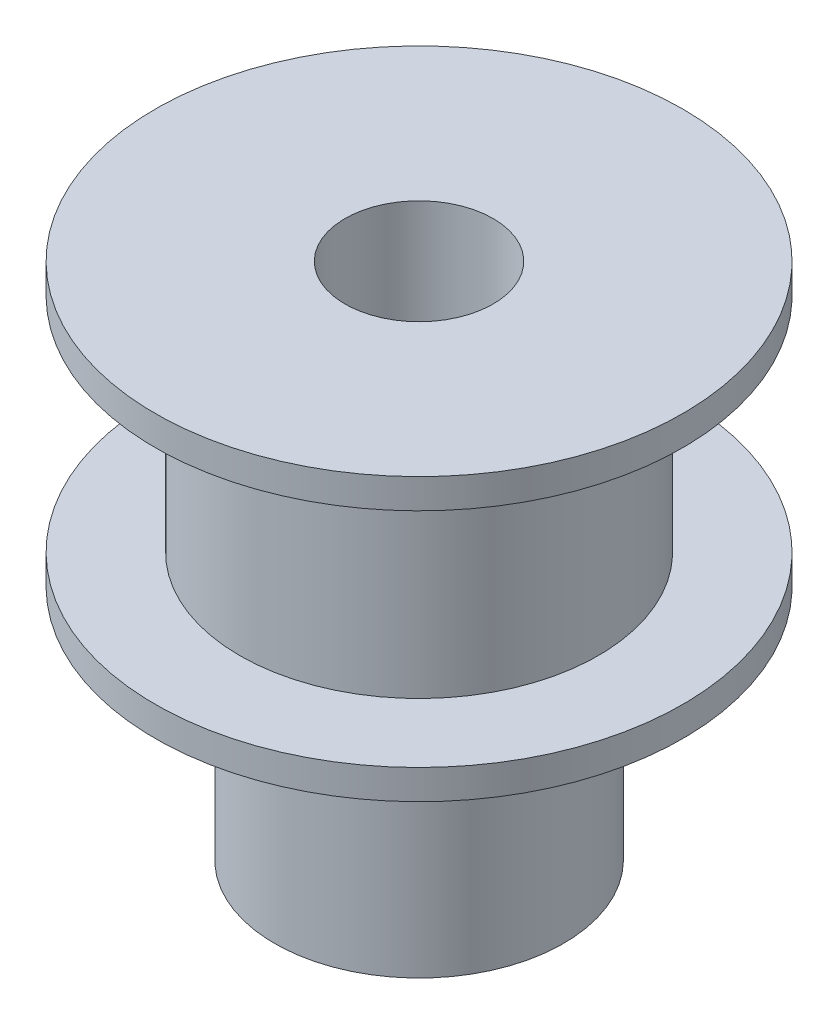
ISO-10303-21;
HEADER;
FILE_DESCRIPTION(('STEP AP214'),'2;1');
FILE_NAME('part.step','',(''),(''),'','','');
FILE_SCHEMA(('AUTOMOTIVE_DESIGN { 1 0 10303 214 1 1 1 1 }'));
ENDSEC;
DATA;
#1=APPLICATION_CONTEXT('core data for automotive mechanical design processes');
#2=APPLICATION_PROTOCOL_DEFINITION('international standard','automotive_design',2000,#1);
#3=PRODUCT_CONTEXT('',#1,'mechanical');
#4=PRODUCT('Part','Part','',(#3));
#5=PRODUCT_RELATED_PRODUCT_CATEGORY('part','',(#4));
#6=PRODUCT_DEFINITION_FORMATION('','',#4);
#7=PRODUCT_DEFINITION_CONTEXT('part definition',#1,'design');
#8=PRODUCT_DEFINITION('design','',#6,#7);
#9=PRODUCT_DEFINITION_SHAPE('','',#8);
#10=(LENGTH_UNIT() NAMED_UNIT(*) SI_UNIT(.MILLI.,.METRE.));
#11=(NAMED_UNIT(*) PLANE_ANGLE_UNIT() SI_UNIT($,.RADIAN.));
#12=(NAMED_UNIT(*) SI_UNIT($,.STERADIAN.) SOLID_ANGLE_UNIT());
#13=UNCERTAINTY_MEASURE_WITH_UNIT(LENGTH_MEASURE(1.E-05),#10,'distance_accuracy_value','');
#14=(GEOMETRIC_REPRESENTATION_CONTEXT(3) GLOBAL_UNCERTAINTY_ASSIGNED_CONTEXT((#13)) GLOBAL_UNIT_ASSIGNED_CONTEXT((#10,
#11,#12)) REPRESENTATION_CONTEXT('',''));
#15=CARTESIAN_POINT('',(0.,0.,0.));
#16=DIRECTION('',(0.,0.,1.));
#17=DIRECTION('',(1.,0.,0.));
#18=AXIS2_PLACEMENT_3D('',#15,#16,#17);
#19=CARTESIAN_POINT('',(-4.875,0.,0.));
#20=DIRECTION('',(0.,1.,0.));
#21=DIRECTION('',(0.,0.,1.));
#22=AXIS2_PLACEMENT_3D('',#19,#20,#21);
#23=PLANE('',#22);
#24=CARTESIAN_POINT('',(0.,0.,0.));
#25=DIRECTION('',(0.,-1.,0.));
#26=DIRECTION('',(0.,0.,-1.));
#27=AXIS2_PLACEMENT_3D('',#24,#25,#26);
#28=CIRCLE('',#27,2.5);
#29=CARTESIAN_POINT('',(0.,0.,-2.5));
#30=VERTEX_POINT('',#29);
#31=EDGE_CURVE('E10',#30,#30,#28,.T.);
#32=ORIENTED_EDGE('',*,*,#31,.F.);
#33=EDGE_LOOP('',(#32));
#34=FACE_BOUND('',#33,.T.);
#35=CARTESIAN_POINT('',(0.,0.,0.));
#36=DIRECTION('',(0.,-1.,0.));
#37=DIRECTION('',(0.,0.,-1.));
#38=AXIS2_PLACEMENT_3D('',#35,#36,#37);
#39=CIRCLE('',#38,4.875);
#40=CARTESIAN_POINT('',(0.,0.,-4.875));
#41=VERTEX_POINT('',#40);
#42=EDGE_CURVE('E64',#41,#41,#39,.T.);
#43=ORIENTED_EDGE('',*,*,#42,.T.);
#44=EDGE_LOOP('',(#43));
#45=FACE_BOUND('',#44,.T.);
#46=ADVANCED_FACE('F30',(#34,#45),#23,.F.);
#47=CARTESIAN_POINT('',(0.,0.,0.));
#48=DIRECTION('',(0.,-1.,0.));
#49=DIRECTION('',(0.,0.,-1.));
#50=AXIS2_PLACEMENT_3D('',#47,#48,#49);
#51=CYLINDRICAL_SURFACE('',#50,2.5);
#52=CARTESIAN_POINT('',(0.,17.5,0.));
#53=DIRECTION('',(0.,-1.,0.));
#54=DIRECTION('',(0.,0.,-1.));
#55=AXIS2_PLACEMENT_3D('',#52,#53,#54);
#56=CIRCLE('',#55,2.5);
#57=CARTESIAN_POINT('',(0.,17.5,-2.5));
#58=VERTEX_POINT('',#57);
#59=EDGE_CURVE('E36',#58,#58,#56,.T.);
#60=ORIENTED_EDGE('',*,*,#59,.F.);
#61=EDGE_LOOP('',(#60));
#62=FACE_BOUND('',#61,.T.);
#63=ORIENTED_EDGE('',*,*,#31,.T.);
#64=EDGE_LOOP('',(#63));
#65=FACE_BOUND('',#64,.T.);
#66=ADVANCED_FACE('F113',(#62,#65),#51,.F.);
#67=CARTESIAN_POINT('',(-2.5,17.5,0.));
#68=DIRECTION('',(0.,-1.,0.));
#69=DIRECTION('',(0.,0.,-1.));
#70=AXIS2_PLACEMENT_3D('',#67,#68,#69);
#71=PLANE('',#70);
#72=CARTESIAN_POINT('',(0.,17.5,0.));
#73=DIRECTION('',(0.,-1.,0.));
#74=DIRECTION('',(0.,0.,-1.));
#75=AXIS2_PLACEMENT_3D('',#72,#73,#74);
#76=CIRCLE('',#75,8.9);
#77=CARTESIAN_POINT('',(0.,17.5,-8.9));
#78=VERTEX_POINT('',#77);
#79=EDGE_CURVE('E40',#78,#78,#76,.T.);
#80=ORIENTED_EDGE('',*,*,#79,.F.);
#81=EDGE_LOOP('',(#80));
#82=FACE_BOUND('',#81,.T.);
#83=ORIENTED_EDGE('',*,*,#59,.T.);
#84=EDGE_LOOP('',(#83));
#85=FACE_BOUND('',#84,.T.);
#86=ADVANCED_FACE('F108',(#82,#85),#71,.F.);
#87=CARTESIAN_POINT('',(0.,0.,0.));
#88=DIRECTION('',(0.,-1.,0.));
#89=DIRECTION('',(0.,0.,-1.));
#90=AXIS2_PLACEMENT_3D('',#87,#88,#89);
#91=CYLINDRICAL_SURFACE('',#90,8.9);
#92=CARTESIAN_POINT('',(0.,16.5,0.));
#93=DIRECTION('',(0.,-1.,0.));
#94=DIRECTION('',(0.,0.,-1.));
#95=AXIS2_PLACEMENT_3D('',#92,#93,#94);
#96=CIRCLE('',#95,8.9);
#97=CARTESIAN_POINT('',(0.,16.5,-8.9));
#98=VERTEX_POINT('',#97);
#99=EDGE_CURVE('E44',#98,#98,#96,.T.);
#100=ORIENTED_EDGE('',*,*,#99,.F.);
#101=EDGE_LOOP('',(#100));
#102=FACE_BOUND('',#101,.T.);
#103=ORIENTED_EDGE('',*,*,#79,.T.);
#104=EDGE_LOOP('',(#103));
#105=FACE_BOUND('',#104,.T.);
#106=ADVANCED_FACE('F102',(#102,#105),#91,.T.);
#107=CARTESIAN_POINT('',(-8.9,16.5,0.));
#108=DIRECTION('',(0.,1.,0.));
#109=DIRECTION('',(0.,0.,1.));
#110=AXIS2_PLACEMENT_3D('',#107,#108,#109);
#111=PLANE('',#110);
#112=CARTESIAN_POINT('',(0.,16.5,0.));
#113=DIRECTION('',(0.,-1.,0.));
#114=DIRECTION('',(0.,0.,-1.));
#115=AXIS2_PLACEMENT_3D('',#112,#113,#114);
#116=CIRCLE('',#115,6.05);
#117=CARTESIAN_POINT('',(0.,16.5,-6.05));
#118=VERTEX_POINT('',#117);
#119=EDGE_CURVE('E49',#118,#118,#116,.T.);
#120=ORIENTED_EDGE('',*,*,#119,.F.);
#121=EDGE_LOOP('',(#120));
#122=FACE_BOUND('',#121,.T.);
#123=ORIENTED_EDGE('',*,*,#99,.T.);
#124=EDGE_LOOP('',(#123));
#125=FACE_BOUND('',#124,.T.);
#126=ADVANCED_FACE('F96',(#122,#125),#111,.F.);
#127=CARTESIAN_POINT('',(0.,0.,0.));
#128=DIRECTION('',(0.,-1.,0.));
#129=DIRECTION('',(0.,0.,-1.));
#130=AXIS2_PLACEMENT_3D('',#127,#128,#129);
#131=CYLINDRICAL_SURFACE('',#130,6.05);
#132=CARTESIAN_POINT('',(0.,9.00000000000001,0.));
#133=DIRECTION('',(0.,-1.,0.));
#134=DIRECTION('',(0.,0.,-1.));
#135=AXIS2_PLACEMENT_3D('',#132,#133,#134);
#136=CIRCLE('',#135,6.05);
#137=CARTESIAN_POINT('',(0.,9.00000000000001,-6.05));
#138=VERTEX_POINT('',#137);
#139=EDGE_CURVE('E52',#138,#138,#136,.T.);
#140=ORIENTED_EDGE('',*,*,#139,.F.);
#141=EDGE_LOOP('',(#140));
#142=FACE_BOUND('',#141,.T.);
#143=ORIENTED_EDGE('',*,*,#119,.T.);
#144=EDGE_LOOP('',(#143));
#145=FACE_BOUND('',#144,.T.);
#146=ADVANCED_FACE('F90',(#142,#145),#131,.T.);
#147=CARTESIAN_POINT('',(-6.05,9.00000000000001,0.));
#148=DIRECTION('',(0.,-1.,0.));
#149=DIRECTION('',(0.,0.,-1.));
#150=AXIS2_PLACEMENT_3D('',#147,#148,#149);
#151=PLANE('',#150);
#152=CARTESIAN_POINT('',(0.,9.00000000000001,0.));
#153=DIRECTION('',(0.,-1.,0.));
#154=DIRECTION('',(0.,0.,-1.));
#155=AXIS2_PLACEMENT_3D('',#152,#153,#154);
#156=CIRCLE('',#155,8.9);
#157=CARTESIAN_POINT('',(0.,9.00000000000001,-8.9));
#158=VERTEX_POINT('',#157);
#159=EDGE_CURVE('E55',#158,#158,#156,.T.);
#160=ORIENTED_EDGE('',*,*,#159,.F.);
#161=EDGE_LOOP('',(#160));
#162=FACE_BOUND('',#161,.T.);
#163=ORIENTED_EDGE('',*,*,#139,.T.);
#164=EDGE_LOOP('',(#163));
#165=FACE_BOUND('',#164,.T.);
#166=ADVANCED_FACE('F84',(#162,#165),#151,.F.);
#167=CARTESIAN_POINT('',(0.,0.,0.));
#168=DIRECTION('',(0.,-1.,0.));
#169=DIRECTION('',(0.,0.,-1.));
#170=AXIS2_PLACEMENT_3D('',#167,#168,#169);
#171=CYLINDRICAL_SURFACE('',#170,8.9);
#172=CARTESIAN_POINT('',(0.,8.00000000000001,0.));
#173=DIRECTION('',(0.,-1.,0.));
#174=DIRECTION('',(0.,0.,-1.));
#175=AXIS2_PLACEMENT_3D('',#172,#173,#174);
#176=CIRCLE('',#175,8.9);
#177=CARTESIAN_POINT('',(0.,8.00000000000001,-8.9));
#178=VERTEX_POINT('',#177);
#179=EDGE_CURVE('E58',#178,#178,#176,.T.);
#180=ORIENTED_EDGE('',*,*,#179,.F.);
#181=EDGE_LOOP('',(#180));
#182=FACE_BOUND('',#181,.T.);
#183=ORIENTED_EDGE('',*,*,#159,.T.);
#184=EDGE_LOOP('',(#183));
#185=FACE_BOUND('',#184,.T.);
#186=ADVANCED_FACE('F78',(#182,#185),#171,.T.);
#187=CARTESIAN_POINT('',(-8.9,8.00000000000001,0.));
#188=DIRECTION('',(0.,1.,0.));
#189=DIRECTION('',(0.,0.,1.));
#190=AXIS2_PLACEMENT_3D('',#187,#188,#189);
#191=PLANE('',#190);
#192=CARTESIAN_POINT('',(0.,8.00000000000001,0.));
#193=DIRECTION('',(0.,-1.,0.));
#194=DIRECTION('',(0.,0.,-1.));
#195=AXIS2_PLACEMENT_3D('',#192,#193,#194);
#196=CIRCLE('',#195,4.875);
#197=CARTESIAN_POINT('',(0.,8.00000000000001,-4.875));
#198=VERTEX_POINT('',#197);
#199=EDGE_CURVE('E61',#198,#198,#196,.T.);
#200=ORIENTED_EDGE('',*,*,#199,.F.);
#201=EDGE_LOOP('',(#200));
#202=FACE_BOUND('',#201,.T.);
#203=ORIENTED_EDGE('',*,*,#179,.T.);
#204=EDGE_LOOP('',(#203));
#205=FACE_BOUND('',#204,.T.);
#206=ADVANCED_FACE('F72',(#202,#205),#191,.F.);
#207=CARTESIAN_POINT('',(0.,0.,0.));
#208=DIRECTION('',(0.,-1.,0.));
#209=DIRECTION('',(0.,0.,-1.));
#210=AXIS2_PLACEMENT_3D('',#207,#208,#209);
#211=CYLINDRICAL_SURFACE('',#210,4.875);
#212=ORIENTED_EDGE('',*,*,#42,.F.);
#213=EDGE_LOOP('',(#212));
#214=FACE_BOUND('',#213,.T.);
#215=ORIENTED_EDGE('',*,*,#199,.T.);
#216=EDGE_LOOP('',(#215));
#217=FACE_BOUND('',#216,.T.);
#218=ADVANCED_FACE('F69',(#214,#217),#211,.T.);
#219=CLOSED_SHELL('',(#46,#66,#86,#106,#126,#146,#166,#186,#206,#218));
#220=MANIFOLD_SOLID_BREP('B2',#219);
#221=ADVANCED_BREP_SHAPE_REPRESENTATION('',(#18,#220),#14);
#222=SHAPE_DEFINITION_REPRESENTATION(#9,#221);
ENDSEC;
END-ISO-10303-21;
